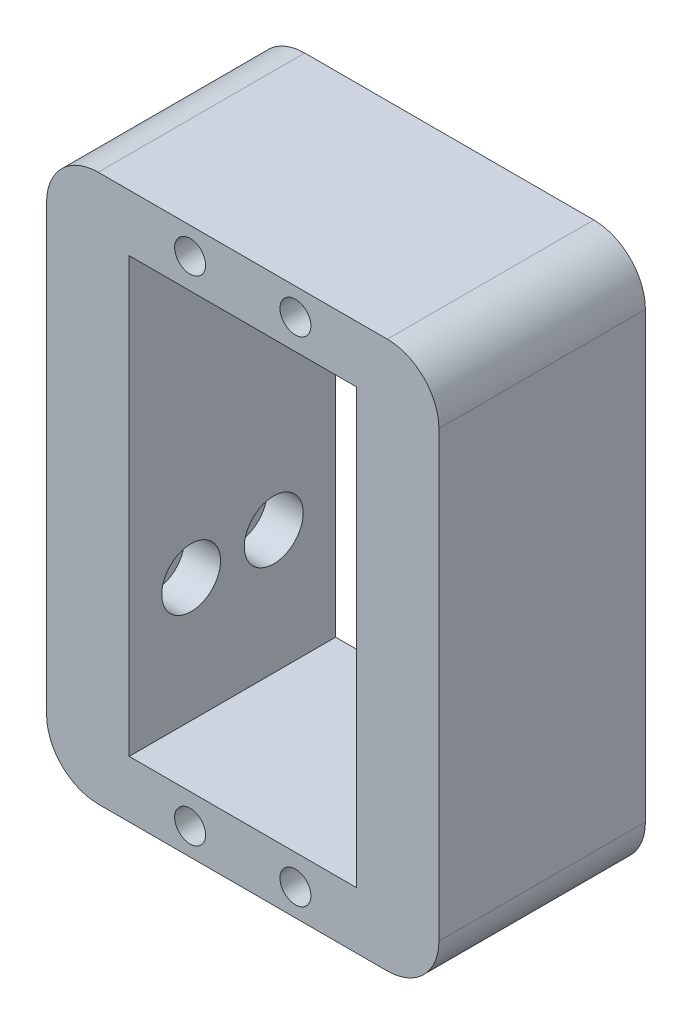
ISO-10303-21;
HEADER;
FILE_DESCRIPTION(('STEP AP214'),'2;1');
FILE_NAME('part.step','',(''),(''),'','','');
FILE_SCHEMA(('AUTOMOTIVE_DESIGN { 1 0 10303 214 1 1 1 1 }'));
ENDSEC;
DATA;
#1=APPLICATION_CONTEXT('core data for automotive mechanical design processes');
#2=APPLICATION_PROTOCOL_DEFINITION('international standard','automotive_design',2000,#1);
#3=PRODUCT_CONTEXT('',#1,'mechanical');
#4=PRODUCT('Part','Part','',(#3));
#5=PRODUCT_RELATED_PRODUCT_CATEGORY('part','',(#4));
#6=PRODUCT_DEFINITION_FORMATION('','',#4);
#7=PRODUCT_DEFINITION_CONTEXT('part definition',#1,'design');
#8=PRODUCT_DEFINITION('design','',#6,#7);
#9=PRODUCT_DEFINITION_SHAPE('','',#8);
#10=(LENGTH_UNIT() NAMED_UNIT(*) SI_UNIT(.MILLI.,.METRE.));
#11=(NAMED_UNIT(*) PLANE_ANGLE_UNIT() SI_UNIT($,.RADIAN.));
#12=(NAMED_UNIT(*) SI_UNIT($,.STERADIAN.) SOLID_ANGLE_UNIT());
#13=UNCERTAINTY_MEASURE_WITH_UNIT(LENGTH_MEASURE(1.E-05),#10,'distance_accuracy_value','');
#14=(GEOMETRIC_REPRESENTATION_CONTEXT(3) GLOBAL_UNCERTAINTY_ASSIGNED_CONTEXT((#13)) GLOBAL_UNIT_ASSIGNED_CONTEXT((#10,
#11,#12)) REPRESENTATION_CONTEXT('',''));
#15=CARTESIAN_POINT('',(0.,0.,0.));
#16=DIRECTION('',(0.,0.,1.));
#17=DIRECTION('',(1.,0.,0.));
#18=AXIS2_PLACEMENT_3D('',#15,#16,#17);
#19=CARTESIAN_POINT('',(-19.,-9.,6.));
#20=DIRECTION('',(1.,0.,0.));
#21=DIRECTION('',(0.,0.,-1.));
#22=AXIS2_PLACEMENT_3D('',#19,#20,#21);
#23=CYLINDRICAL_SURFACE('',#22,1.75);
#24=CARTESIAN_POINT('',(-19.,-9.,6.));
#25=DIRECTION('',(1.,0.,0.));
#26=DIRECTION('',(0.,0.,-1.));
#27=AXIS2_PLACEMENT_3D('',#24,#25,#26);
#28=CIRCLE('',#27,1.75);
#29=CARTESIAN_POINT('',(-19.,-9.,4.25));
#30=VERTEX_POINT('',#29);
#31=EDGE_CURVE('E421',#30,#30,#28,.T.);
#32=ORIENTED_EDGE('',*,*,#31,.F.);
#33=EDGE_LOOP('',(#32));
#34=FACE_BOUND('',#33,.T.);
#35=CARTESIAN_POINT('',(-14.5,-9.,6.));
#36=DIRECTION('',(1.,0.,0.));
#37=DIRECTION('',(0.,0.,-1.));
#38=AXIS2_PLACEMENT_3D('',#35,#36,#37);
#39=CIRCLE('',#38,1.75);
#40=CARTESIAN_POINT('',(-14.5,-9.,4.25));
#41=VERTEX_POINT('',#40);
#42=EDGE_CURVE('E402',#41,#41,#39,.T.);
#43=ORIENTED_EDGE('',*,*,#42,.T.);
#44=EDGE_LOOP('',(#43));
#45=FACE_BOUND('',#44,.T.);
#46=ADVANCED_FACE('F37',(#34,#45),#23,.F.);
#47=CARTESIAN_POINT('',(-19.,-9.,14.));
#48=DIRECTION('',(1.,0.,0.));
#49=DIRECTION('',(0.,0.,-1.));
#50=AXIS2_PLACEMENT_3D('',#47,#48,#49);
#51=CYLINDRICAL_SURFACE('',#50,1.75);
#52=CARTESIAN_POINT('',(-19.,-9.,14.));
#53=DIRECTION('',(1.,0.,0.));
#54=DIRECTION('',(0.,0.,-1.));
#55=AXIS2_PLACEMENT_3D('',#52,#53,#54);
#56=CIRCLE('',#55,1.75);
#57=CARTESIAN_POINT('',(-19.,-9.,12.25));
#58=VERTEX_POINT('',#57);
#59=EDGE_CURVE('E417',#58,#58,#56,.T.);
#60=ORIENTED_EDGE('',*,*,#59,.F.);
#61=EDGE_LOOP('',(#60));
#62=FACE_BOUND('',#61,.T.);
#63=CARTESIAN_POINT('',(-14.5,-9.,14.));
#64=DIRECTION('',(1.,0.,0.));
#65=DIRECTION('',(0.,0.,-1.));
#66=AXIS2_PLACEMENT_3D('',#63,#64,#65);
#67=CIRCLE('',#66,1.75);
#68=CARTESIAN_POINT('',(-14.5,-9.,12.25));
#69=VERTEX_POINT('',#68);
#70=EDGE_CURVE('E406',#69,#69,#67,.T.);
#71=ORIENTED_EDGE('',*,*,#70,.T.);
#72=EDGE_LOOP('',(#71));
#73=FACE_BOUND('',#72,.T.);
#74=ADVANCED_FACE('F265',(#62,#73),#51,.F.);
#75=CARTESIAN_POINT('',(0.,0.,20.));
#76=DIRECTION('',(0.,0.,1.));
#77=DIRECTION('',(1.,0.,0.));
#78=AXIS2_PLACEMENT_3D('',#75,#76,#77);
#79=PLANE('',#78);
#80=CARTESIAN_POINT('',(-5.1,-23.8999999999999,20.));
#81=DIRECTION('',(0.,0.,-1.));
#82=DIRECTION('',(-1.,0.,0.));
#83=AXIS2_PLACEMENT_3D('',#80,#81,#82);
#84=CIRCLE('',#83,1.5);
#85=CARTESIAN_POINT('',(-6.6,-23.8999999999999,20.));
#86=VERTEX_POINT('',#85);
#87=EDGE_CURVE('E431',#86,#86,#84,.T.);
#88=ORIENTED_EDGE('',*,*,#87,.T.);
#89=EDGE_LOOP('',(#88));
#90=FACE_BOUND('',#89,.T.);
#91=CARTESIAN_POINT('',(5.1,23.9000000000001,20.));
#92=DIRECTION('',(0.,0.,-1.));
#93=DIRECTION('',(-1.,0.,0.));
#94=AXIS2_PLACEMENT_3D('',#91,#92,#93);
#95=CIRCLE('',#94,1.5);
#96=CARTESIAN_POINT('',(3.6,23.9000000000001,20.));
#97=VERTEX_POINT('',#96);
#98=EDGE_CURVE('E438',#97,#97,#95,.T.);
#99=ORIENTED_EDGE('',*,*,#98,.T.);
#100=EDGE_LOOP('',(#99));
#101=FACE_BOUND('',#100,.T.);
#102=CARTESIAN_POINT('',(-5.1,23.9000000000001,20.));
#103=DIRECTION('',(0.,0.,-1.));
#104=DIRECTION('',(-1.,0.,0.));
#105=AXIS2_PLACEMENT_3D('',#102,#103,#104);
#106=CIRCLE('',#105,1.5);
#107=CARTESIAN_POINT('',(-6.6,23.9000000000001,20.));
#108=VERTEX_POINT('',#107);
#109=EDGE_CURVE('E425',#108,#108,#106,.T.);
#110=ORIENTED_EDGE('',*,*,#109,.T.);
#111=EDGE_LOOP('',(#110));
#112=FACE_BOUND('',#111,.T.);
#113=CARTESIAN_POINT('',(5.1,-23.8999999999999,20.));
#114=DIRECTION('',(0.,0.,-1.));
#115=DIRECTION('',(-1.,0.,0.));
#116=AXIS2_PLACEMENT_3D('',#113,#114,#115);
#117=CIRCLE('',#116,1.5);
#118=CARTESIAN_POINT('',(3.59999999999999,-23.8999999999999,20.));
#119=VERTEX_POINT('',#118);
#120=EDGE_CURVE('E160',#119,#119,#117,.T.);
#121=ORIENTED_EDGE('',*,*,#120,.T.);
#122=EDGE_LOOP('',(#121));
#123=FACE_BOUND('',#122,.T.);
#124=DIRECTION('',(0.,-1.,0.));
#125=VECTOR('',#124,1.);
#126=CARTESIAN_POINT('',(-19.,26.5,20.));
#127=LINE('',#126,#125);
#128=CARTESIAN_POINT('',(-19.,21.5,20.));
#129=VERTEX_POINT('',#128);
#130=CARTESIAN_POINT('',(-19.,-21.5,20.));
#131=VERTEX_POINT('',#130);
#132=EDGE_CURVE('E176',#129,#131,#127,.T.);
#133=ORIENTED_EDGE('',*,*,#132,.T.);
#134=CARTESIAN_POINT('',(-14.,-21.5,20.));
#135=DIRECTION('',(0.,0.,1.));
#136=DIRECTION('',(1.,0.,0.));
#137=AXIS2_PLACEMENT_3D('',#134,#135,#136);
#138=CIRCLE('',#137,5.);
#139=CARTESIAN_POINT('',(-14.,-26.5,20.));
#140=VERTEX_POINT('',#139);
#141=EDGE_CURVE('E214',#131,#140,#138,.T.);
#142=ORIENTED_EDGE('',*,*,#141,.T.);
#143=DIRECTION('',(1.,0.,0.));
#144=VECTOR('',#143,1.);
#145=CARTESIAN_POINT('',(-19.,-26.5,20.));
#146=LINE('',#145,#144);
#147=CARTESIAN_POINT('',(14.,-26.5,20.));
#148=VERTEX_POINT('',#147);
#149=EDGE_CURVE('E179',#140,#148,#146,.T.);
#150=ORIENTED_EDGE('',*,*,#149,.T.);
#151=CARTESIAN_POINT('',(14.,-21.5,20.));
#152=DIRECTION('',(0.,0.,1.));
#153=DIRECTION('',(1.,0.,0.));
#154=AXIS2_PLACEMENT_3D('',#151,#152,#153);
#155=CIRCLE('',#154,5.);
#156=CARTESIAN_POINT('',(19.,-21.5,20.));
#157=VERTEX_POINT('',#156);
#158=EDGE_CURVE('E212',#148,#157,#155,.T.);
#159=ORIENTED_EDGE('',*,*,#158,.T.);
#160=DIRECTION('',(0.,1.,0.));
#161=VECTOR('',#160,1.);
#162=CARTESIAN_POINT('',(19.,26.5,20.));
#163=LINE('',#162,#161);
#164=CARTESIAN_POINT('',(19.,21.5,20.));
#165=VERTEX_POINT('',#164);
#166=EDGE_CURVE('E171',#157,#165,#163,.T.);
#167=ORIENTED_EDGE('',*,*,#166,.T.);
#168=CARTESIAN_POINT('',(14.,21.5,20.));
#169=DIRECTION('',(0.,0.,1.));
#170=DIRECTION('',(1.,0.,0.));
#171=AXIS2_PLACEMENT_3D('',#168,#169,#170);
#172=CIRCLE('',#171,5.);
#173=CARTESIAN_POINT('',(14.,26.5,20.));
#174=VERTEX_POINT('',#173);
#175=EDGE_CURVE('E57',#165,#174,#172,.T.);
#176=ORIENTED_EDGE('',*,*,#175,.T.);
#177=DIRECTION('',(-1.,0.,0.));
#178=VECTOR('',#177,1.);
#179=CARTESIAN_POINT('',(-19.,26.5,20.));
#180=LINE('',#179,#178);
#181=CARTESIAN_POINT('',(-14.,26.5,20.));
#182=VERTEX_POINT('',#181);
#183=EDGE_CURVE('E173',#174,#182,#180,.T.);
#184=ORIENTED_EDGE('',*,*,#183,.T.);
#185=CARTESIAN_POINT('',(-14.,21.5,20.));
#186=DIRECTION('',(0.,0.,1.));
#187=DIRECTION('',(1.,0.,0.));
#188=AXIS2_PLACEMENT_3D('',#185,#186,#187);
#189=CIRCLE('',#188,5.);
#190=EDGE_CURVE('E210',#182,#129,#189,.T.);
#191=ORIENTED_EDGE('',*,*,#190,.T.);
#192=EDGE_LOOP('',(#133,#142,#150,#159,#167,#176,#184,#191));
#193=FACE_BOUND('',#192,.T.);
#194=DIRECTION('',(-1.,0.,0.));
#195=VECTOR('',#194,1.);
#196=CARTESIAN_POINT('',(-11.,21.,20.));
#197=LINE('',#196,#195);
#198=CARTESIAN_POINT('',(11.,21.,20.));
#199=VERTEX_POINT('',#198);
#200=CARTESIAN_POINT('',(-11.,21.,20.));
#201=VERTEX_POINT('',#200);
#202=EDGE_CURVE('E137',#199,#201,#197,.T.);
#203=ORIENTED_EDGE('',*,*,#202,.F.);
#204=DIRECTION('',(0.,1.,0.));
#205=VECTOR('',#204,1.);
#206=CARTESIAN_POINT('',(11.,21.,20.));
#207=LINE('',#206,#205);
#208=CARTESIAN_POINT('',(11.,-21.,20.));
#209=VERTEX_POINT('',#208);
#210=EDGE_CURVE('E127',#209,#199,#207,.T.);
#211=ORIENTED_EDGE('',*,*,#210,.F.);
#212=DIRECTION('',(1.,0.,0.));
#213=VECTOR('',#212,1.);
#214=CARTESIAN_POINT('',(-11.,-21.,20.));
#215=LINE('',#214,#213);
#216=CARTESIAN_POINT('',(-11.,-21.,20.));
#217=VERTEX_POINT('',#216);
#218=EDGE_CURVE('E153',#217,#209,#215,.T.);
#219=ORIENTED_EDGE('',*,*,#218,.F.);
#220=DIRECTION('',(0.,-1.,0.));
#221=VECTOR('',#220,1.);
#222=CARTESIAN_POINT('',(-11.,21.,20.));
#223=LINE('',#222,#221);
#224=EDGE_CURVE('E151',#201,#217,#223,.T.);
#225=ORIENTED_EDGE('',*,*,#224,.F.);
#226=EDGE_LOOP('',(#203,#211,#219,#225));
#227=FACE_BOUND('',#226,.T.);
#228=ADVANCED_FACE('F149',(#90,#101,#112,#123,#193,#227),#79,.T.);
#229=CARTESIAN_POINT('',(0.,0.,0.));
#230=DIRECTION('',(0.,0.,1.));
#231=DIRECTION('',(1.,0.,0.));
#232=AXIS2_PLACEMENT_3D('',#229,#230,#231);
#233=PLANE('',#232);
#234=CARTESIAN_POINT('',(-5.1,-23.8999999999999,0.));
#235=DIRECTION('',(0.,0.,-1.));
#236=DIRECTION('',(-1.,0.,0.));
#237=AXIS2_PLACEMENT_3D('',#234,#235,#236);
#238=CIRCLE('',#237,1.5);
#239=CARTESIAN_POINT('',(-6.6,-23.8999999999999,0.));
#240=VERTEX_POINT('',#239);
#241=EDGE_CURVE('E435',#240,#240,#238,.T.);
#242=ORIENTED_EDGE('',*,*,#241,.F.);
#243=EDGE_LOOP('',(#242));
#244=FACE_BOUND('',#243,.T.);
#245=CARTESIAN_POINT('',(5.1,23.9000000000001,0.));
#246=DIRECTION('',(0.,0.,-1.));
#247=DIRECTION('',(-1.,0.,0.));
#248=AXIS2_PLACEMENT_3D('',#245,#246,#247);
#249=CIRCLE('',#248,1.5);
#250=CARTESIAN_POINT('',(3.6,23.9000000000001,0.));
#251=VERTEX_POINT('',#250);
#252=EDGE_CURVE('E428',#251,#251,#249,.T.);
#253=ORIENTED_EDGE('',*,*,#252,.F.);
#254=EDGE_LOOP('',(#253));
#255=FACE_BOUND('',#254,.T.);
#256=CARTESIAN_POINT('',(-5.1,23.9000000000001,0.));
#257=DIRECTION('',(0.,0.,-1.));
#258=DIRECTION('',(-1.,0.,0.));
#259=AXIS2_PLACEMENT_3D('',#256,#257,#258);
#260=CIRCLE('',#259,1.5);
#261=CARTESIAN_POINT('',(-6.6,23.9000000000001,0.));
#262=VERTEX_POINT('',#261);
#263=EDGE_CURVE('E420',#262,#262,#260,.T.);
#264=ORIENTED_EDGE('',*,*,#263,.F.);
#265=EDGE_LOOP('',(#264));
#266=FACE_BOUND('',#265,.T.);
#267=CARTESIAN_POINT('',(5.1,-23.8999999999999,0.));
#268=DIRECTION('',(0.,0.,-1.));
#269=DIRECTION('',(-1.,0.,0.));
#270=AXIS2_PLACEMENT_3D('',#267,#268,#269);
#271=CIRCLE('',#270,1.5);
#272=CARTESIAN_POINT('',(3.59999999999999,-23.8999999999999,0.));
#273=VERTEX_POINT('',#272);
#274=EDGE_CURVE('E434',#273,#273,#271,.T.);
#275=ORIENTED_EDGE('',*,*,#274,.F.);
#276=EDGE_LOOP('',(#275));
#277=FACE_BOUND('',#276,.T.);
#278=DIRECTION('',(1.,0.,0.));
#279=VECTOR('',#278,1.);
#280=CARTESIAN_POINT('',(-19.,-26.5,0.));
#281=LINE('',#280,#279);
#282=CARTESIAN_POINT('',(-14.,-26.5,0.));
#283=VERTEX_POINT('',#282);
#284=CARTESIAN_POINT('',(14.,-26.5,0.));
#285=VERTEX_POINT('',#284);
#286=EDGE_CURVE('E174',#283,#285,#281,.T.);
#287=ORIENTED_EDGE('',*,*,#286,.F.);
#288=CARTESIAN_POINT('',(-14.,-21.5,0.));
#289=DIRECTION('',(0.,0.,1.));
#290=DIRECTION('',(1.,0.,0.));
#291=AXIS2_PLACEMENT_3D('',#288,#289,#290);
#292=CIRCLE('',#291,5.);
#293=CARTESIAN_POINT('',(-19.,-21.5,0.));
#294=VERTEX_POINT('',#293);
#295=EDGE_CURVE('E202',#283,#294,#292,.F.);
#296=ORIENTED_EDGE('',*,*,#295,.T.);
#297=DIRECTION('',(0.,-1.,0.));
#298=VECTOR('',#297,1.);
#299=CARTESIAN_POINT('',(-19.,26.5,0.));
#300=LINE('',#299,#298);
#301=CARTESIAN_POINT('',(-19.,21.5,0.));
#302=VERTEX_POINT('',#301);
#303=EDGE_CURVE('E187',#302,#294,#300,.T.);
#304=ORIENTED_EDGE('',*,*,#303,.F.);
#305=CARTESIAN_POINT('',(-14.,21.5,0.));
#306=DIRECTION('',(0.,0.,1.));
#307=DIRECTION('',(1.,0.,0.));
#308=AXIS2_PLACEMENT_3D('',#305,#306,#307);
#309=CIRCLE('',#308,5.);
#310=CARTESIAN_POINT('',(-14.,26.5,0.));
#311=VERTEX_POINT('',#310);
#312=EDGE_CURVE('E198',#302,#311,#309,.F.);
#313=ORIENTED_EDGE('',*,*,#312,.T.);
#314=DIRECTION('',(-1.,0.,0.));
#315=VECTOR('',#314,1.);
#316=CARTESIAN_POINT('',(-19.,26.5,0.));
#317=LINE('',#316,#315);
#318=CARTESIAN_POINT('',(14.,26.5,0.));
#319=VERTEX_POINT('',#318);
#320=EDGE_CURVE('E185',#319,#311,#317,.T.);
#321=ORIENTED_EDGE('',*,*,#320,.F.);
#322=CARTESIAN_POINT('',(14.,21.5,0.));
#323=DIRECTION('',(0.,0.,1.));
#324=DIRECTION('',(1.,0.,0.));
#325=AXIS2_PLACEMENT_3D('',#322,#323,#324);
#326=CIRCLE('',#325,5.);
#327=CARTESIAN_POINT('',(19.,21.5,0.));
#328=VERTEX_POINT('',#327);
#329=EDGE_CURVE('E196',#319,#328,#326,.F.);
#330=ORIENTED_EDGE('',*,*,#329,.T.);
#331=DIRECTION('',(0.,1.,0.));
#332=VECTOR('',#331,1.);
#333=CARTESIAN_POINT('',(19.,26.5,0.));
#334=LINE('',#333,#332);
#335=CARTESIAN_POINT('',(19.,-21.5,0.));
#336=VERTEX_POINT('',#335);
#337=EDGE_CURVE('E145',#336,#328,#334,.T.);
#338=ORIENTED_EDGE('',*,*,#337,.F.);
#339=CARTESIAN_POINT('',(14.,-21.5,0.));
#340=DIRECTION('',(0.,0.,1.));
#341=DIRECTION('',(1.,0.,0.));
#342=AXIS2_PLACEMENT_3D('',#339,#340,#341);
#343=CIRCLE('',#342,5.);
#344=EDGE_CURVE('E200',#336,#285,#343,.F.);
#345=ORIENTED_EDGE('',*,*,#344,.T.);
#346=EDGE_LOOP('',(#287,#296,#304,#313,#321,#330,#338,#345));
#347=FACE_BOUND('',#346,.T.);
#348=DIRECTION('',(0.,1.,0.));
#349=VECTOR('',#348,1.);
#350=CARTESIAN_POINT('',(11.,21.,0.));
#351=LINE('',#350,#349);
#352=CARTESIAN_POINT('',(11.,-21.,0.));
#353=VERTEX_POINT('',#352);
#354=CARTESIAN_POINT('',(11.,21.,0.));
#355=VERTEX_POINT('',#354);
#356=EDGE_CURVE('E158',#353,#355,#351,.T.);
#357=ORIENTED_EDGE('',*,*,#356,.T.);
#358=DIRECTION('',(-1.,0.,0.));
#359=VECTOR('',#358,1.);
#360=CARTESIAN_POINT('',(-11.,21.,0.));
#361=LINE('',#360,#359);
#362=CARTESIAN_POINT('',(-11.,21.,0.));
#363=VERTEX_POINT('',#362);
#364=EDGE_CURVE('E144',#355,#363,#361,.T.);
#365=ORIENTED_EDGE('',*,*,#364,.T.);
#366=DIRECTION('',(0.,-1.,0.));
#367=VECTOR('',#366,1.);
#368=CARTESIAN_POINT('',(-11.,21.,0.));
#369=LINE('',#368,#367);
#370=CARTESIAN_POINT('',(-11.,-21.,0.));
#371=VERTEX_POINT('',#370);
#372=EDGE_CURVE('E162',#363,#371,#369,.T.);
#373=ORIENTED_EDGE('',*,*,#372,.T.);
#374=DIRECTION('',(1.,0.,0.));
#375=VECTOR('',#374,1.);
#376=CARTESIAN_POINT('',(-11.,-21.,0.));
#377=LINE('',#376,#375);
#378=EDGE_CURVE('E138',#371,#353,#377,.T.);
#379=ORIENTED_EDGE('',*,*,#378,.T.);
#380=EDGE_LOOP('',(#357,#365,#373,#379));
#381=FACE_BOUND('',#380,.T.);
#382=ADVANCED_FACE('F227',(#244,#255,#266,#277,#347,#381),#233,.F.);
#383=CARTESIAN_POINT('',(19.,26.5,20.));
#384=DIRECTION('',(-1.,0.,0.));
#385=DIRECTION('',(0.,0.,1.));
#386=AXIS2_PLACEMENT_3D('',#383,#384,#385);
#387=PLANE('',#386);
#388=ORIENTED_EDGE('',*,*,#166,.F.);
#389=DIRECTION('',(0.,0.,-1.));
#390=VECTOR('',#389,1.);
#391=CARTESIAN_POINT('',(19.,-21.5,20.));
#392=LINE('',#391,#390);
#393=EDGE_CURVE('E218',#157,#336,#392,.T.);
#394=ORIENTED_EDGE('',*,*,#393,.T.);
#395=ORIENTED_EDGE('',*,*,#337,.T.);
#396=DIRECTION('',(0.,0.,-1.));
#397=VECTOR('',#396,1.);
#398=CARTESIAN_POINT('',(19.,21.5,20.));
#399=LINE('',#398,#397);
#400=EDGE_CURVE('E216',#328,#165,#399,.F.);
#401=ORIENTED_EDGE('',*,*,#400,.T.);
#402=EDGE_LOOP('',(#388,#394,#395,#401));
#403=FACE_BOUND('',#402,.T.);
#404=ADVANCED_FACE('F253',(#403),#387,.F.);
#405=CARTESIAN_POINT('',(-19.,26.5,20.));
#406=DIRECTION('',(0.,-1.,0.));
#407=DIRECTION('',(0.,0.,-1.));
#408=AXIS2_PLACEMENT_3D('',#405,#406,#407);
#409=PLANE('',#408);
#410=ORIENTED_EDGE('',*,*,#320,.T.);
#411=DIRECTION('',(0.,0.,-1.));
#412=VECTOR('',#411,1.);
#413=CARTESIAN_POINT('',(-14.,26.5,20.));
#414=LINE('',#413,#412);
#415=EDGE_CURVE('E11',#311,#182,#414,.F.);
#416=ORIENTED_EDGE('',*,*,#415,.T.);
#417=ORIENTED_EDGE('',*,*,#183,.F.);
#418=DIRECTION('',(0.,0.,-1.));
#419=VECTOR('',#418,1.);
#420=CARTESIAN_POINT('',(14.,26.5,20.));
#421=LINE('',#420,#419);
#422=EDGE_CURVE('E45',#174,#319,#421,.T.);
#423=ORIENTED_EDGE('',*,*,#422,.T.);
#424=EDGE_LOOP('',(#410,#416,#417,#423));
#425=FACE_BOUND('',#424,.T.);
#426=ADVANCED_FACE('F223',(#425),#409,.F.);
#427=CARTESIAN_POINT('',(-19.,26.5,20.));
#428=DIRECTION('',(1.,0.,0.));
#429=DIRECTION('',(0.,0.,-1.));
#430=AXIS2_PLACEMENT_3D('',#427,#428,#429);
#431=PLANE('',#430);
#432=ORIENTED_EDGE('',*,*,#59,.T.);
#433=EDGE_LOOP('',(#432));
#434=FACE_BOUND('',#433,.T.);
#435=ORIENTED_EDGE('',*,*,#31,.T.);
#436=EDGE_LOOP('',(#435));
#437=FACE_BOUND('',#436,.T.);
#438=ORIENTED_EDGE('',*,*,#303,.T.);
#439=DIRECTION('',(0.,0.,-1.));
#440=VECTOR('',#439,1.);
#441=CARTESIAN_POINT('',(-19.,-21.5,20.));
#442=LINE('',#441,#440);
#443=EDGE_CURVE('E207',#294,#131,#442,.F.);
#444=ORIENTED_EDGE('',*,*,#443,.T.);
#445=ORIENTED_EDGE('',*,*,#132,.F.);
#446=DIRECTION('',(0.,0.,-1.));
#447=VECTOR('',#446,1.);
#448=CARTESIAN_POINT('',(-19.,21.5,20.));
#449=LINE('',#448,#447);
#450=EDGE_CURVE('E204',#129,#302,#449,.T.);
#451=ORIENTED_EDGE('',*,*,#450,.T.);
#452=EDGE_LOOP('',(#438,#444,#445,#451));
#453=FACE_BOUND('',#452,.T.);
#454=ADVANCED_FACE('F237',(#434,#437,#453),#431,.F.);
#455=CARTESIAN_POINT('',(-19.,-26.5,20.));
#456=DIRECTION('',(0.,1.,0.));
#457=DIRECTION('',(0.,0.,1.));
#458=AXIS2_PLACEMENT_3D('',#455,#456,#457);
#459=PLANE('',#458);
#460=ORIENTED_EDGE('',*,*,#149,.F.);
#461=DIRECTION('',(0.,0.,-1.));
#462=VECTOR('',#461,1.);
#463=CARTESIAN_POINT('',(-14.,-26.5,20.));
#464=LINE('',#463,#462);
#465=EDGE_CURVE('E193',#140,#283,#464,.T.);
#466=ORIENTED_EDGE('',*,*,#465,.T.);
#467=ORIENTED_EDGE('',*,*,#286,.T.);
#468=DIRECTION('',(0.,0.,-1.));
#469=VECTOR('',#468,1.);
#470=CARTESIAN_POINT('',(14.,-26.5,20.));
#471=LINE('',#470,#469);
#472=EDGE_CURVE('E182',#285,#148,#471,.F.);
#473=ORIENTED_EDGE('',*,*,#472,.T.);
#474=EDGE_LOOP('',(#460,#466,#467,#473));
#475=FACE_BOUND('',#474,.T.);
#476=ADVANCED_FACE('F245',(#475),#459,.F.);
#477=CARTESIAN_POINT('',(11.,21.,20.));
#478=DIRECTION('',(-1.,0.,0.));
#479=DIRECTION('',(0.,-1.,0.));
#480=AXIS2_PLACEMENT_3D('',#477,#478,#479);
#481=PLANE('',#480);
#482=ORIENTED_EDGE('',*,*,#356,.F.);
#483=DIRECTION('',(0.,0.,-1.));
#484=VECTOR('',#483,1.);
#485=CARTESIAN_POINT('',(11.,-21.,20.));
#486=LINE('',#485,#484);
#487=EDGE_CURVE('E133',#209,#353,#486,.T.);
#488=ORIENTED_EDGE('',*,*,#487,.F.);
#489=ORIENTED_EDGE('',*,*,#210,.T.);
#490=DIRECTION('',(0.,0.,-1.));
#491=VECTOR('',#490,1.);
#492=CARTESIAN_POINT('',(11.,21.,20.));
#493=LINE('',#492,#491);
#494=EDGE_CURVE('E130',#199,#355,#493,.T.);
#495=ORIENTED_EDGE('',*,*,#494,.T.);
#496=EDGE_LOOP('',(#482,#488,#489,#495));
#497=FACE_BOUND('',#496,.T.);
#498=ADVANCED_FACE('F129',(#497),#481,.T.);
#499=CARTESIAN_POINT('',(-11.,21.,20.));
#500=DIRECTION('',(0.,-1.,0.));
#501=DIRECTION('',(0.,0.,-1.));
#502=AXIS2_PLACEMENT_3D('',#499,#500,#501);
#503=PLANE('',#502);
#504=ORIENTED_EDGE('',*,*,#364,.F.);
#505=ORIENTED_EDGE('',*,*,#494,.F.);
#506=ORIENTED_EDGE('',*,*,#202,.T.);
#507=DIRECTION('',(0.,0.,-1.));
#508=VECTOR('',#507,1.);
#509=CARTESIAN_POINT('',(-11.,21.,20.));
#510=LINE('',#509,#508);
#511=EDGE_CURVE('E146',#201,#363,#510,.T.);
#512=ORIENTED_EDGE('',*,*,#511,.T.);
#513=EDGE_LOOP('',(#504,#505,#506,#512));
#514=FACE_BOUND('',#513,.T.);
#515=ADVANCED_FACE('F141',(#514),#503,.T.);
#516=CARTESIAN_POINT('',(-11.,21.,20.));
#517=DIRECTION('',(1.,0.,0.));
#518=DIRECTION('',(0.,0.,-1.));
#519=AXIS2_PLACEMENT_3D('',#516,#517,#518);
#520=PLANE('',#519);
#521=CARTESIAN_POINT('',(-11.,-9.,14.));
#522=DIRECTION('',(1.,0.,0.));
#523=DIRECTION('',(0.,0.,-1.));
#524=AXIS2_PLACEMENT_3D('',#521,#522,#523);
#525=CIRCLE('',#524,2.85);
#526=CARTESIAN_POINT('',(-11.,-9.,11.15));
#527=VERTEX_POINT('',#526);
#528=EDGE_CURVE('E410',#527,#527,#525,.T.);
#529=ORIENTED_EDGE('',*,*,#528,.F.);
#530=EDGE_LOOP('',(#529));
#531=FACE_BOUND('',#530,.T.);
#532=CARTESIAN_POINT('',(-11.,-9.,6.));
#533=DIRECTION('',(1.,0.,0.));
#534=DIRECTION('',(0.,0.,-1.));
#535=AXIS2_PLACEMENT_3D('',#532,#533,#534);
#536=CIRCLE('',#535,2.85);
#537=CARTESIAN_POINT('',(-11.,-9.,3.15));
#538=VERTEX_POINT('',#537);
#539=EDGE_CURVE('E407',#538,#538,#536,.T.);
#540=ORIENTED_EDGE('',*,*,#539,.F.);
#541=EDGE_LOOP('',(#540));
#542=FACE_BOUND('',#541,.T.);
#543=ORIENTED_EDGE('',*,*,#372,.F.);
#544=ORIENTED_EDGE('',*,*,#511,.F.);
#545=ORIENTED_EDGE('',*,*,#224,.T.);
#546=DIRECTION('',(0.,0.,-1.));
#547=VECTOR('',#546,1.);
#548=CARTESIAN_POINT('',(-11.,-21.,20.));
#549=LINE('',#548,#547);
#550=EDGE_CURVE('E168',#217,#371,#549,.T.);
#551=ORIENTED_EDGE('',*,*,#550,.T.);
#552=EDGE_LOOP('',(#543,#544,#545,#551));
#553=FACE_BOUND('',#552,.T.);
#554=ADVANCED_FACE('F296',(#531,#542,#553),#520,.T.);
#555=CARTESIAN_POINT('',(-11.,-21.,20.));
#556=DIRECTION('',(0.,1.,0.));
#557=DIRECTION('',(0.,0.,1.));
#558=AXIS2_PLACEMENT_3D('',#555,#556,#557);
#559=PLANE('',#558);
#560=ORIENTED_EDGE('',*,*,#378,.F.);
#561=ORIENTED_EDGE('',*,*,#550,.F.);
#562=ORIENTED_EDGE('',*,*,#218,.T.);
#563=ORIENTED_EDGE('',*,*,#487,.T.);
#564=EDGE_LOOP('',(#560,#561,#562,#563));
#565=FACE_BOUND('',#564,.T.);
#566=ADVANCED_FACE('F292',(#565),#559,.T.);
#567=CARTESIAN_POINT('',(5.1,-23.8999999999999,20.));
#568=DIRECTION('',(0.,0.,-1.));
#569=DIRECTION('',(-1.,0.,0.));
#570=AXIS2_PLACEMENT_3D('',#567,#568,#569);
#571=CYLINDRICAL_SURFACE('',#570,1.5);
#572=ORIENTED_EDGE('',*,*,#120,.F.);
#573=EDGE_LOOP('',(#572));
#574=FACE_BOUND('',#573,.T.);
#575=ORIENTED_EDGE('',*,*,#274,.T.);
#576=EDGE_LOOP('',(#575));
#577=FACE_BOUND('',#576,.T.);
#578=ADVANCED_FACE('F281',(#574,#577),#571,.F.);
#579=CARTESIAN_POINT('',(-5.1,23.9000000000001,20.));
#580=DIRECTION('',(0.,0.,-1.));
#581=DIRECTION('',(-1.,0.,0.));
#582=AXIS2_PLACEMENT_3D('',#579,#580,#581);
#583=CYLINDRICAL_SURFACE('',#582,1.5);
#584=ORIENTED_EDGE('',*,*,#109,.F.);
#585=EDGE_LOOP('',(#584));
#586=FACE_BOUND('',#585,.T.);
#587=ORIENTED_EDGE('',*,*,#263,.T.);
#588=EDGE_LOOP('',(#587));
#589=FACE_BOUND('',#588,.T.);
#590=ADVANCED_FACE('F277',(#586,#589),#583,.F.);
#591=CARTESIAN_POINT('',(5.1,23.9000000000001,20.));
#592=DIRECTION('',(0.,0.,-1.));
#593=DIRECTION('',(-1.,0.,0.));
#594=AXIS2_PLACEMENT_3D('',#591,#592,#593);
#595=CYLINDRICAL_SURFACE('',#594,1.5);
#596=ORIENTED_EDGE('',*,*,#98,.F.);
#597=EDGE_LOOP('',(#596));
#598=FACE_BOUND('',#597,.T.);
#599=ORIENTED_EDGE('',*,*,#252,.T.);
#600=EDGE_LOOP('',(#599));
#601=FACE_BOUND('',#600,.T.);
#602=ADVANCED_FACE('F280',(#598,#601),#595,.F.);
#603=CARTESIAN_POINT('',(-5.1,-23.8999999999999,20.));
#604=DIRECTION('',(0.,0.,-1.));
#605=DIRECTION('',(-1.,0.,0.));
#606=AXIS2_PLACEMENT_3D('',#603,#604,#605);
#607=CYLINDRICAL_SURFACE('',#606,1.5);
#608=ORIENTED_EDGE('',*,*,#87,.F.);
#609=EDGE_LOOP('',(#608));
#610=FACE_BOUND('',#609,.T.);
#611=ORIENTED_EDGE('',*,*,#241,.T.);
#612=EDGE_LOOP('',(#611));
#613=FACE_BOUND('',#612,.T.);
#614=ADVANCED_FACE('F283',(#610,#613),#607,.F.);
#615=CARTESIAN_POINT('',(-14.,-21.5,20.));
#616=DIRECTION('',(0.,0.,-1.));
#617=DIRECTION('',(-1.,0.,0.));
#618=AXIS2_PLACEMENT_3D('',#615,#616,#617);
#619=CYLINDRICAL_SURFACE('',#618,5.);
#620=ORIENTED_EDGE('',*,*,#141,.F.);
#621=ORIENTED_EDGE('',*,*,#443,.F.);
#622=ORIENTED_EDGE('',*,*,#295,.F.);
#623=ORIENTED_EDGE('',*,*,#465,.F.);
#624=EDGE_LOOP('',(#620,#621,#622,#623));
#625=FACE_BOUND('',#624,.T.);
#626=ADVANCED_FACE('F243',(#625),#619,.T.);
#627=CARTESIAN_POINT('',(14.,-21.5,20.));
#628=DIRECTION('',(0.,0.,-1.));
#629=DIRECTION('',(-1.,0.,0.));
#630=AXIS2_PLACEMENT_3D('',#627,#628,#629);
#631=CYLINDRICAL_SURFACE('',#630,5.);
#632=ORIENTED_EDGE('',*,*,#158,.F.);
#633=ORIENTED_EDGE('',*,*,#472,.F.);
#634=ORIENTED_EDGE('',*,*,#344,.F.);
#635=ORIENTED_EDGE('',*,*,#393,.F.);
#636=EDGE_LOOP('',(#632,#633,#634,#635));
#637=FACE_BOUND('',#636,.T.);
#638=ADVANCED_FACE('F250',(#637),#631,.T.);
#639=CARTESIAN_POINT('',(-14.,21.5,20.));
#640=DIRECTION('',(0.,0.,-1.));
#641=DIRECTION('',(-1.,0.,0.));
#642=AXIS2_PLACEMENT_3D('',#639,#640,#641);
#643=CYLINDRICAL_SURFACE('',#642,5.);
#644=ORIENTED_EDGE('',*,*,#190,.F.);
#645=ORIENTED_EDGE('',*,*,#415,.F.);
#646=ORIENTED_EDGE('',*,*,#312,.F.);
#647=ORIENTED_EDGE('',*,*,#450,.F.);
#648=EDGE_LOOP('',(#644,#645,#646,#647));
#649=FACE_BOUND('',#648,.T.);
#650=ADVANCED_FACE('F234',(#649),#643,.T.);
#651=CARTESIAN_POINT('',(14.,21.5,20.));
#652=DIRECTION('',(0.,0.,-1.));
#653=DIRECTION('',(-1.,0.,0.));
#654=AXIS2_PLACEMENT_3D('',#651,#652,#653);
#655=CYLINDRICAL_SURFACE('',#654,5.);
#656=ORIENTED_EDGE('',*,*,#175,.F.);
#657=ORIENTED_EDGE('',*,*,#400,.F.);
#658=ORIENTED_EDGE('',*,*,#329,.F.);
#659=ORIENTED_EDGE('',*,*,#422,.F.);
#660=EDGE_LOOP('',(#656,#657,#658,#659));
#661=FACE_BOUND('',#660,.T.);
#662=ADVANCED_FACE('F39',(#661),#655,.T.);
#663=CARTESIAN_POINT('',(-14.5,-9.,14.));
#664=DIRECTION('',(1.,0.,0.));
#665=DIRECTION('',(0.,0.,-1.));
#666=AXIS2_PLACEMENT_3D('',#663,#664,#665);
#667=CYLINDRICAL_SURFACE('',#666,2.85);
#668=CARTESIAN_POINT('',(-14.5,-9.,14.));
#669=DIRECTION('',(1.,0.,0.));
#670=DIRECTION('',(0.,0.,-1.));
#671=AXIS2_PLACEMENT_3D('',#668,#669,#670);
#672=CIRCLE('',#671,2.85);
#673=CARTESIAN_POINT('',(-14.5,-9.,11.15));
#674=VERTEX_POINT('',#673);
#675=EDGE_CURVE('E424',#674,#674,#672,.T.);
#676=ORIENTED_EDGE('',*,*,#675,.F.);
#677=EDGE_LOOP('',(#676));
#678=FACE_BOUND('',#677,.T.);
#679=ORIENTED_EDGE('',*,*,#528,.T.);
#680=EDGE_LOOP('',(#679));
#681=FACE_BOUND('',#680,.T.);
#682=ADVANCED_FACE('F256',(#678,#681),#667,.F.);
#683=CARTESIAN_POINT('',(-14.5,-9.,14.));
#684=DIRECTION('',(1.,0.,0.));
#685=DIRECTION('',(0.,0.,-1.));
#686=AXIS2_PLACEMENT_3D('',#683,#684,#685);
#687=PLANE('',#686);
#688=ORIENTED_EDGE('',*,*,#70,.F.);
#689=EDGE_LOOP('',(#688));
#690=FACE_BOUND('',#689,.T.);
#691=ORIENTED_EDGE('',*,*,#675,.T.);
#692=EDGE_LOOP('',(#691));
#693=FACE_BOUND('',#692,.T.);
#694=ADVANCED_FACE('F261',(#690,#693),#687,.T.);
#695=CARTESIAN_POINT('',(-14.5,-9.,6.));
#696=DIRECTION('',(1.,0.,0.));
#697=DIRECTION('',(0.,0.,-1.));
#698=AXIS2_PLACEMENT_3D('',#695,#696,#697);
#699=CYLINDRICAL_SURFACE('',#698,2.85);
#700=CARTESIAN_POINT('',(-14.5,-9.,6.));
#701=DIRECTION('',(1.,0.,0.));
#702=DIRECTION('',(0.,0.,-1.));
#703=AXIS2_PLACEMENT_3D('',#700,#701,#702);
#704=CIRCLE('',#703,2.85);
#705=CARTESIAN_POINT('',(-14.5,-9.,3.15));
#706=VERTEX_POINT('',#705);
#707=EDGE_CURVE('E405',#706,#706,#704,.T.);
#708=ORIENTED_EDGE('',*,*,#707,.F.);
#709=EDGE_LOOP('',(#708));
#710=FACE_BOUND('',#709,.T.);
#711=ORIENTED_EDGE('',*,*,#539,.T.);
#712=EDGE_LOOP('',(#711));
#713=FACE_BOUND('',#712,.T.);
#714=ADVANCED_FACE('F376',(#710,#713),#699,.F.);
#715=CARTESIAN_POINT('',(-14.5,-9.,6.));
#716=DIRECTION('',(1.,0.,0.));
#717=DIRECTION('',(0.,0.,-1.));
#718=AXIS2_PLACEMENT_3D('',#715,#716,#717);
#719=PLANE('',#718);
#720=ORIENTED_EDGE('',*,*,#42,.F.);
#721=EDGE_LOOP('',(#720));
#722=FACE_BOUND('',#721,.T.);
#723=ORIENTED_EDGE('',*,*,#707,.T.);
#724=EDGE_LOOP('',(#723));
#725=FACE_BOUND('',#724,.T.);
#726=ADVANCED_FACE('F386',(#722,#725),#719,.T.);
#727=CLOSED_SHELL('',(#46,#74,#228,#382,#404,#426,#454,#476,#498,#515,#554,#566,#578,#590,#602,
#614,#626,#638,#650,#662,#682,#694,#714,#726));
#728=MANIFOLD_SOLID_BREP('B2',#727);
#729=ADVANCED_BREP_SHAPE_REPRESENTATION('',(#18,#728),#14);
#730=SHAPE_DEFINITION_REPRESENTATION(#9,#729);
ENDSEC;
END-ISO-10303-21;
